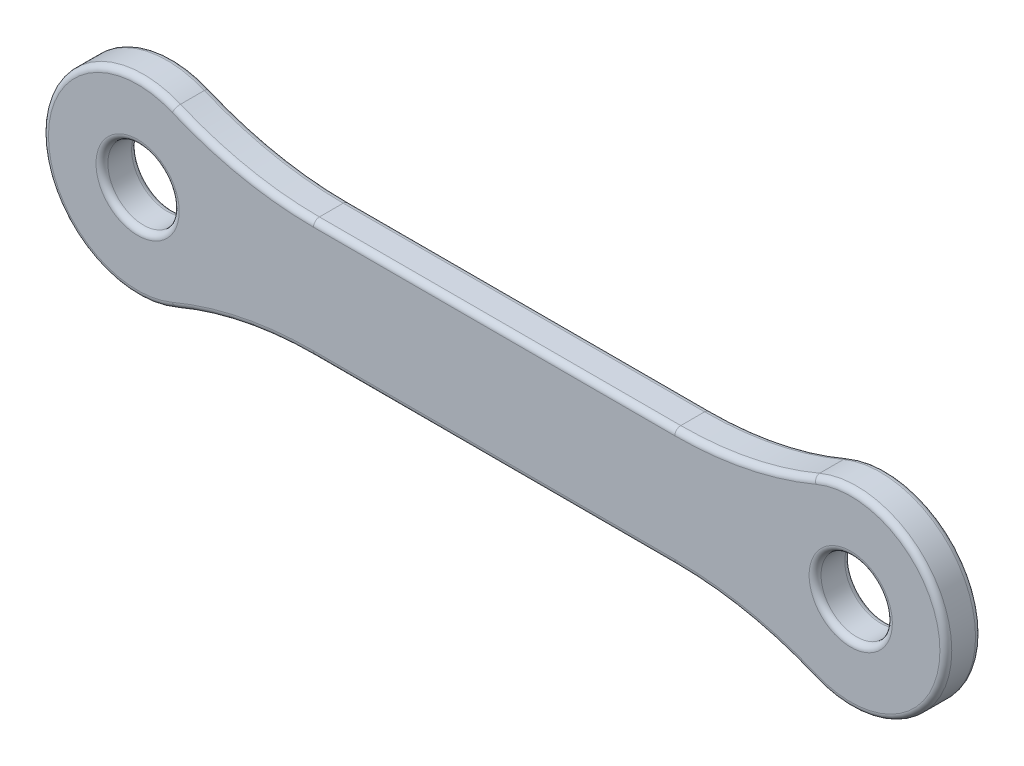
ISO-10303-21;
HEADER;
FILE_DESCRIPTION(('STEP AP214'),'2;1');
FILE_NAME('part.step','',(''),(''),'','','');
FILE_SCHEMA(('AUTOMOTIVE_DESIGN { 1 0 10303 214 1 1 1 1 }'));
ENDSEC;
DATA;
#1=APPLICATION_CONTEXT('core data for automotive mechanical design processes');
#2=APPLICATION_PROTOCOL_DEFINITION('international standard','automotive_design',2000,#1);
#3=PRODUCT_CONTEXT('',#1,'mechanical');
#4=PRODUCT('Part','Part','',(#3));
#5=PRODUCT_RELATED_PRODUCT_CATEGORY('part','',(#4));
#6=PRODUCT_DEFINITION_FORMATION('','',#4);
#7=PRODUCT_DEFINITION_CONTEXT('part definition',#1,'design');
#8=PRODUCT_DEFINITION('design','',#6,#7);
#9=PRODUCT_DEFINITION_SHAPE('','',#8);
#10=(LENGTH_UNIT() NAMED_UNIT(*) SI_UNIT(.MILLI.,.METRE.));
#11=(NAMED_UNIT(*) PLANE_ANGLE_UNIT() SI_UNIT($,.RADIAN.));
#12=(NAMED_UNIT(*) SI_UNIT($,.STERADIAN.) SOLID_ANGLE_UNIT());
#13=UNCERTAINTY_MEASURE_WITH_UNIT(LENGTH_MEASURE(1.E-05),#10,'distance_accuracy_value','');
#14=(GEOMETRIC_REPRESENTATION_CONTEXT(3) GLOBAL_UNCERTAINTY_ASSIGNED_CONTEXT((#13)) GLOBAL_UNIT_ASSIGNED_CONTEXT((#10,
#11,#12)) REPRESENTATION_CONTEXT('',''));
#15=CARTESIAN_POINT('',(0.,0.,0.));
#16=DIRECTION('',(0.,0.,1.));
#17=DIRECTION('',(1.,0.,0.));
#18=AXIS2_PLACEMENT_3D('',#15,#16,#17);
#19=CARTESIAN_POINT('',(0.,0.,3.));
#20=DIRECTION('',(0.,0.,1.));
#21=DIRECTION('',(1.,0.,0.));
#22=AXIS2_PLACEMENT_3D('',#19,#20,#21);
#23=PLANE('',#22);
#24=CARTESIAN_POINT('',(60.,0.,3.));
#25=DIRECTION('',(0.,0.,1.));
#26=DIRECTION('',(1.,0.,0.));
#27=AXIS2_PLACEMENT_3D('',#24,#25,#26);
#28=CIRCLE('',#27,3.50000000000001);
#29=CARTESIAN_POINT('',(63.5,0.,3.));
#30=VERTEX_POINT('',#29);
#31=EDGE_CURVE('E11',#30,#30,#28,.F.);
#32=ORIENTED_EDGE('',*,*,#31,.T.);
#33=EDGE_LOOP('',(#32));
#34=FACE_BOUND('',#33,.T.);
#35=CARTESIAN_POINT('',(0.,0.,3.));
#36=DIRECTION('',(0.,0.,1.));
#37=DIRECTION('',(1.,0.,0.));
#38=AXIS2_PLACEMENT_3D('',#35,#36,#37);
#39=CIRCLE('',#38,3.5);
#40=CARTESIAN_POINT('',(3.5,0.,3.));
#41=VERTEX_POINT('',#40);
#42=EDGE_CURVE('E49',#41,#41,#39,.F.);
#43=ORIENTED_EDGE('',*,*,#42,.T.);
#44=EDGE_LOOP('',(#43));
#45=FACE_BOUND('',#44,.T.);
#46=DIRECTION('',(-1.,0.,0.));
#47=VECTOR('',#46,1.);
#48=CARTESIAN_POINT('',(14.7986485869487,4.5,3.));
#49=LINE('',#48,#47);
#50=CARTESIAN_POINT('',(45.2013514130512,4.5,3.));
#51=VERTEX_POINT('',#50);
#52=CARTESIAN_POINT('',(14.7986485869487,4.5,3.));
#53=VERTEX_POINT('',#52);
#54=EDGE_CURVE('E57',#51,#53,#49,.T.);
#55=ORIENTED_EDGE('',*,*,#54,.T.);
#56=CARTESIAN_POINT('',(14.7986485869487,35.,3.));
#57=DIRECTION('',(0.,0.,1.));
#58=DIRECTION('',(1.,0.,0.));
#59=AXIS2_PLACEMENT_3D('',#56,#57,#58);
#60=CIRCLE('',#59,30.5);
#61=CARTESIAN_POINT('',(2.92078590531883,6.9078947368421,3.));
#62=VERTEX_POINT('',#61);
#63=EDGE_CURVE('E248',#53,#62,#60,.F.);
#64=ORIENTED_EDGE('',*,*,#63,.T.);
#65=CARTESIAN_POINT('',(0.,0.,3.));
#66=DIRECTION('',(0.,0.,1.));
#67=DIRECTION('',(1.,0.,0.));
#68=AXIS2_PLACEMENT_3D('',#65,#66,#67);
#69=CIRCLE('',#68,7.5);
#70=CARTESIAN_POINT('',(2.92078590531883,-6.9078947368421,3.));
#71=VERTEX_POINT('',#70);
#72=EDGE_CURVE('E236',#62,#71,#69,.T.);
#73=ORIENTED_EDGE('',*,*,#72,.T.);
#74=CARTESIAN_POINT('',(14.7986485869487,-35.,3.));
#75=DIRECTION('',(0.,0.,1.));
#76=DIRECTION('',(1.,0.,0.));
#77=AXIS2_PLACEMENT_3D('',#74,#75,#76);
#78=CIRCLE('',#77,30.5);
#79=CARTESIAN_POINT('',(14.7986485869488,-4.5,3.));
#80=VERTEX_POINT('',#79);
#81=EDGE_CURVE('E238',#71,#80,#78,.F.);
#82=ORIENTED_EDGE('',*,*,#81,.T.);
#83=DIRECTION('',(1.,0.,0.));
#84=VECTOR('',#83,1.);
#85=CARTESIAN_POINT('',(45.2013514130512,-4.5,3.));
#86=LINE('',#85,#84);
#87=CARTESIAN_POINT('',(45.2013514130512,-4.5,3.));
#88=VERTEX_POINT('',#87);
#89=EDGE_CURVE('E240',#80,#88,#86,.T.);
#90=ORIENTED_EDGE('',*,*,#89,.T.);
#91=CARTESIAN_POINT('',(45.2013514130512,-35.,3.));
#92=DIRECTION('',(0.,0.,1.));
#93=DIRECTION('',(1.,0.,0.));
#94=AXIS2_PLACEMENT_3D('',#91,#92,#93);
#95=CIRCLE('',#94,30.5);
#96=CARTESIAN_POINT('',(57.0792140946812,-6.90789473684211,3.));
#97=VERTEX_POINT('',#96);
#98=EDGE_CURVE('E242',#88,#97,#95,.F.);
#99=ORIENTED_EDGE('',*,*,#98,.T.);
#100=CARTESIAN_POINT('',(60.,0.,3.));
#101=DIRECTION('',(0.,0.,1.));
#102=DIRECTION('',(1.,0.,0.));
#103=AXIS2_PLACEMENT_3D('',#100,#101,#102);
#104=CIRCLE('',#103,7.50000000000001);
#105=CARTESIAN_POINT('',(57.0792140946812,6.90789473684211,3.));
#106=VERTEX_POINT('',#105);
#107=EDGE_CURVE('E244',#97,#106,#104,.T.);
#108=ORIENTED_EDGE('',*,*,#107,.T.);
#109=CARTESIAN_POINT('',(45.2013514130512,35.,3.));
#110=DIRECTION('',(0.,0.,1.));
#111=DIRECTION('',(1.,0.,0.));
#112=AXIS2_PLACEMENT_3D('',#109,#110,#111);
#113=CIRCLE('',#112,30.5);
#114=EDGE_CURVE('E62',#106,#51,#113,.F.);
#115=ORIENTED_EDGE('',*,*,#114,.T.);
#116=EDGE_LOOP('',(#55,#64,#73,#82,#90,#99,#108,#115));
#117=FACE_BOUND('',#116,.T.);
#118=ADVANCED_FACE('F40',(#34,#45,#117),#23,.T.);
#119=CARTESIAN_POINT('',(0.,0.,0.));
#120=DIRECTION('',(0.,0.,1.));
#121=DIRECTION('',(1.,0.,0.));
#122=AXIS2_PLACEMENT_3D('',#119,#120,#121);
#123=PLANE('',#122);
#124=CARTESIAN_POINT('',(60.,0.,0.));
#125=DIRECTION('',(0.,0.,1.));
#126=DIRECTION('',(1.,0.,0.));
#127=AXIS2_PLACEMENT_3D('',#124,#125,#126);
#128=CIRCLE('',#127,3.50000000000001);
#129=CARTESIAN_POINT('',(63.5,0.,0.));
#130=VERTEX_POINT('',#129);
#131=EDGE_CURVE('E184',#130,#130,#128,.T.);
#132=ORIENTED_EDGE('',*,*,#131,.T.);
#133=EDGE_LOOP('',(#132));
#134=FACE_BOUND('',#133,.T.);
#135=CARTESIAN_POINT('',(0.,0.,0.));
#136=DIRECTION('',(0.,0.,1.));
#137=DIRECTION('',(1.,0.,0.));
#138=AXIS2_PLACEMENT_3D('',#135,#136,#137);
#139=CIRCLE('',#138,3.5);
#140=CARTESIAN_POINT('',(3.5,0.,0.));
#141=VERTEX_POINT('',#140);
#142=EDGE_CURVE('E181',#141,#141,#139,.T.);
#143=ORIENTED_EDGE('',*,*,#142,.T.);
#144=EDGE_LOOP('',(#143));
#145=FACE_BOUND('',#144,.T.);
#146=CARTESIAN_POINT('',(0.,0.,0.));
#147=DIRECTION('',(0.,0.,1.));
#148=DIRECTION('',(1.,0.,0.));
#149=AXIS2_PLACEMENT_3D('',#146,#147,#148);
#150=CIRCLE('',#149,7.5);
#151=CARTESIAN_POINT('',(2.92078590531883,-6.9078947368421,0.));
#152=VERTEX_POINT('',#151);
#153=CARTESIAN_POINT('',(2.92078590531883,6.9078947368421,0.));
#154=VERTEX_POINT('',#153);
#155=EDGE_CURVE('E179',#152,#154,#150,.F.);
#156=ORIENTED_EDGE('',*,*,#155,.T.);
#157=CARTESIAN_POINT('',(14.7986485869487,35.,0.));
#158=DIRECTION('',(0.,0.,1.));
#159=DIRECTION('',(1.,0.,0.));
#160=AXIS2_PLACEMENT_3D('',#157,#158,#159);
#161=CIRCLE('',#160,30.5);
#162=CARTESIAN_POINT('',(14.7986485869487,4.5,0.));
#163=VERTEX_POINT('',#162);
#164=EDGE_CURVE('E160',#154,#163,#161,.T.);
#165=ORIENTED_EDGE('',*,*,#164,.T.);
#166=DIRECTION('',(-1.,0.,0.));
#167=VECTOR('',#166,1.);
#168=CARTESIAN_POINT('',(0.,4.5,0.));
#169=LINE('',#168,#167);
#170=CARTESIAN_POINT('',(45.2013514130512,4.5,0.));
#171=VERTEX_POINT('',#170);
#172=EDGE_CURVE('E168',#163,#171,#169,.F.);
#173=ORIENTED_EDGE('',*,*,#172,.T.);
#174=CARTESIAN_POINT('',(45.2013514130512,35.,0.));
#175=DIRECTION('',(0.,0.,1.));
#176=DIRECTION('',(1.,0.,0.));
#177=AXIS2_PLACEMENT_3D('',#174,#175,#176);
#178=CIRCLE('',#177,30.5);
#179=CARTESIAN_POINT('',(57.0792140946812,6.90789473684211,0.));
#180=VERTEX_POINT('',#179);
#181=EDGE_CURVE('E174',#171,#180,#178,.T.);
#182=ORIENTED_EDGE('',*,*,#181,.T.);
#183=CARTESIAN_POINT('',(60.,0.,0.));
#184=DIRECTION('',(0.,0.,1.));
#185=DIRECTION('',(1.,0.,0.));
#186=AXIS2_PLACEMENT_3D('',#183,#184,#185);
#187=CIRCLE('',#186,7.50000000000001);
#188=CARTESIAN_POINT('',(57.0792140946812,-6.90789473684211,0.));
#189=VERTEX_POINT('',#188);
#190=EDGE_CURVE('E334',#180,#189,#187,.F.);
#191=ORIENTED_EDGE('',*,*,#190,.T.);
#192=CARTESIAN_POINT('',(45.2013514130512,-35.,0.));
#193=DIRECTION('',(0.,0.,1.));
#194=DIRECTION('',(1.,0.,0.));
#195=AXIS2_PLACEMENT_3D('',#192,#193,#194);
#196=CIRCLE('',#195,30.5);
#197=CARTESIAN_POINT('',(45.2013514130512,-4.5,0.));
#198=VERTEX_POINT('',#197);
#199=EDGE_CURVE('E336',#189,#198,#196,.T.);
#200=ORIENTED_EDGE('',*,*,#199,.T.);
#201=DIRECTION('',(1.,0.,0.));
#202=VECTOR('',#201,1.);
#203=CARTESIAN_POINT('',(0.,-4.5,0.));
#204=LINE('',#203,#202);
#205=CARTESIAN_POINT('',(14.7986485869488,-4.5,0.));
#206=VERTEX_POINT('',#205);
#207=EDGE_CURVE('E338',#198,#206,#204,.F.);
#208=ORIENTED_EDGE('',*,*,#207,.T.);
#209=CARTESIAN_POINT('',(14.7986485869487,-35.,0.));
#210=DIRECTION('',(0.,0.,1.));
#211=DIRECTION('',(1.,0.,0.));
#212=AXIS2_PLACEMENT_3D('',#209,#210,#211);
#213=CIRCLE('',#212,30.5);
#214=EDGE_CURVE('E186',#206,#152,#213,.T.);
#215=ORIENTED_EDGE('',*,*,#214,.T.);
#216=EDGE_LOOP('',(#156,#165,#173,#182,#191,#200,#208,#215));
#217=FACE_BOUND('',#216,.T.);
#218=ADVANCED_FACE('F177',(#134,#145,#217),#123,.F.);
#219=CARTESIAN_POINT('',(60.,-5.,3.));
#220=DIRECTION('',(0.,1.,0.));
#221=DIRECTION('',(0.,0.,1.));
#222=AXIS2_PLACEMENT_3D('',#219,#220,#221);
#223=PLANE('',#222);
#224=DIRECTION('',(0.,0.,1.));
#225=VECTOR('',#224,1.);
#226=CARTESIAN_POINT('',(14.7986485869488,-5.,3.));
#227=LINE('',#226,#225);
#228=CARTESIAN_POINT('',(14.7986485869488,-5.,2.5));
#229=VERTEX_POINT('',#228);
#230=CARTESIAN_POINT('',(14.7986485869488,-5.,0.5));
#231=VERTEX_POINT('',#230);
#232=EDGE_CURVE('E314',#229,#231,#227,.F.);
#233=ORIENTED_EDGE('',*,*,#232,.T.);
#234=DIRECTION('',(1.,0.,0.));
#235=VECTOR('',#234,1.);
#236=CARTESIAN_POINT('',(60.,-5.,0.5));
#237=LINE('',#236,#235);
#238=CARTESIAN_POINT('',(45.2013514130512,-5.,0.5));
#239=VERTEX_POINT('',#238);
#240=EDGE_CURVE('E218',#231,#239,#237,.T.);
#241=ORIENTED_EDGE('',*,*,#240,.T.);
#242=DIRECTION('',(0.,0.,1.));
#243=VECTOR('',#242,1.);
#244=CARTESIAN_POINT('',(45.2013514130512,-5.,3.));
#245=LINE('',#244,#243);
#246=CARTESIAN_POINT('',(45.2013514130512,-5.,2.5));
#247=VERTEX_POINT('',#246);
#248=EDGE_CURVE('E269',#239,#247,#245,.T.);
#249=ORIENTED_EDGE('',*,*,#248,.T.);
#250=DIRECTION('',(1.,0.,0.));
#251=VECTOR('',#250,1.);
#252=CARTESIAN_POINT('',(14.7986485869488,-5.,2.5));
#253=LINE('',#252,#251);
#254=EDGE_CURVE('E216',#247,#229,#253,.F.);
#255=ORIENTED_EDGE('',*,*,#254,.T.);
#256=EDGE_LOOP('',(#233,#241,#249,#255));
#257=FACE_BOUND('',#256,.T.);
#258=ADVANCED_FACE('F311',(#257),#223,.F.);
#259=CARTESIAN_POINT('',(0.,5.,3.));
#260=DIRECTION('',(0.,-1.,0.));
#261=DIRECTION('',(1.,0.,0.));
#262=AXIS2_PLACEMENT_3D('',#259,#260,#261);
#263=PLANE('',#262);
#264=DIRECTION('',(0.,0.,1.));
#265=VECTOR('',#264,1.);
#266=CARTESIAN_POINT('',(45.2013514130512,5.,3.));
#267=LINE('',#266,#265);
#268=CARTESIAN_POINT('',(45.2013514130512,5.,2.5));
#269=VERTEX_POINT('',#268);
#270=CARTESIAN_POINT('',(45.2013514130512,5.,0.5));
#271=VERTEX_POINT('',#270);
#272=EDGE_CURVE('E175',#269,#271,#267,.F.);
#273=ORIENTED_EDGE('',*,*,#272,.T.);
#274=DIRECTION('',(-1.,0.,0.));
#275=VECTOR('',#274,1.);
#276=CARTESIAN_POINT('',(0.,5.,0.5));
#277=LINE('',#276,#275);
#278=CARTESIAN_POINT('',(14.7986485869487,5.,0.5));
#279=VERTEX_POINT('',#278);
#280=EDGE_CURVE('E234',#271,#279,#277,.T.);
#281=ORIENTED_EDGE('',*,*,#280,.T.);
#282=DIRECTION('',(0.,0.,1.));
#283=VECTOR('',#282,1.);
#284=CARTESIAN_POINT('',(14.7986485869487,5.,3.));
#285=LINE('',#284,#283);
#286=CARTESIAN_POINT('',(14.7986485869487,5.,2.5));
#287=VERTEX_POINT('',#286);
#288=EDGE_CURVE('E328',#279,#287,#285,.T.);
#289=ORIENTED_EDGE('',*,*,#288,.T.);
#290=DIRECTION('',(-1.,0.,0.));
#291=VECTOR('',#290,1.);
#292=CARTESIAN_POINT('',(45.2013514130512,5.,2.5));
#293=LINE('',#292,#291);
#294=EDGE_CURVE('E232',#287,#269,#293,.F.);
#295=ORIENTED_EDGE('',*,*,#294,.T.);
#296=EDGE_LOOP('',(#273,#281,#289,#295));
#297=FACE_BOUND('',#296,.T.);
#298=ADVANCED_FACE('F368',(#297),#263,.F.);
#299=CARTESIAN_POINT('',(0.,0.,3.));
#300=DIRECTION('',(0.,0.,-1.));
#301=DIRECTION('',(-1.,0.,0.));
#302=AXIS2_PLACEMENT_3D('',#299,#300,#301);
#303=CYLINDRICAL_SURFACE('',#302,3.);
#304=CARTESIAN_POINT('',(0.,0.,0.5));
#305=DIRECTION('',(0.,0.,1.));
#306=DIRECTION('',(1.,0.,0.));
#307=AXIS2_PLACEMENT_3D('',#304,#305,#306);
#308=CIRCLE('',#307,3.);
#309=CARTESIAN_POINT('',(3.,0.,0.5));
#310=VERTEX_POINT('',#309);
#311=EDGE_CURVE('E201',#310,#310,#308,.F.);
#312=ORIENTED_EDGE('',*,*,#311,.T.);
#313=EDGE_LOOP('',(#312));
#314=FACE_BOUND('',#313,.T.);
#315=CARTESIAN_POINT('',(0.,0.,2.5));
#316=DIRECTION('',(0.,0.,1.));
#317=DIRECTION('',(1.,0.,0.));
#318=AXIS2_PLACEMENT_3D('',#315,#316,#317);
#319=CIRCLE('',#318,3.);
#320=CARTESIAN_POINT('',(3.,0.,2.5));
#321=VERTEX_POINT('',#320);
#322=EDGE_CURVE('E198',#321,#321,#319,.T.);
#323=ORIENTED_EDGE('',*,*,#322,.T.);
#324=EDGE_LOOP('',(#323));
#325=FACE_BOUND('',#324,.T.);
#326=ADVANCED_FACE('F406',(#314,#325),#303,.F.);
#327=CARTESIAN_POINT('',(60.,0.,3.));
#328=DIRECTION('',(0.,0.,-1.));
#329=DIRECTION('',(-1.,0.,0.));
#330=AXIS2_PLACEMENT_3D('',#327,#328,#329);
#331=CYLINDRICAL_SURFACE('',#330,3.00000000000001);
#332=CARTESIAN_POINT('',(60.,0.,0.5));
#333=DIRECTION('',(0.,0.,1.));
#334=DIRECTION('',(1.,0.,0.));
#335=AXIS2_PLACEMENT_3D('',#332,#333,#334);
#336=CIRCLE('',#335,3.00000000000001);
#337=CARTESIAN_POINT('',(63.,0.,0.5));
#338=VERTEX_POINT('',#337);
#339=EDGE_CURVE('E195',#338,#338,#336,.F.);
#340=ORIENTED_EDGE('',*,*,#339,.T.);
#341=EDGE_LOOP('',(#340));
#342=FACE_BOUND('',#341,.T.);
#343=CARTESIAN_POINT('',(60.,0.,2.5));
#344=DIRECTION('',(0.,0.,1.));
#345=DIRECTION('',(1.,0.,0.));
#346=AXIS2_PLACEMENT_3D('',#343,#344,#345);
#347=CIRCLE('',#346,3.00000000000001);
#348=CARTESIAN_POINT('',(63.,0.,2.5));
#349=VERTEX_POINT('',#348);
#350=EDGE_CURVE('E192',#349,#349,#347,.T.);
#351=ORIENTED_EDGE('',*,*,#350,.T.);
#352=EDGE_LOOP('',(#351));
#353=FACE_BOUND('',#352,.T.);
#354=ADVANCED_FACE('F670',(#342,#353),#331,.F.);
#355=CARTESIAN_POINT('',(0.,0.,-22.6274169979695));
#356=DIRECTION('',(0.,0.,1.));
#357=DIRECTION('',(1.,0.,0.));
#358=AXIS2_PLACEMENT_3D('',#355,#356,#357);
#359=CYLINDRICAL_SURFACE('',#358,8.);
#360=DIRECTION('',(0.,0.,1.));
#361=VECTOR('',#360,1.);
#362=CARTESIAN_POINT('',(3.11550496567342,7.36842105263158,-22.6274169979695));
#363=LINE('',#362,#361);
#364=CARTESIAN_POINT('',(3.11550496567342,7.36842105263158,2.5));
#365=VERTEX_POINT('',#364);
#366=CARTESIAN_POINT('',(3.11550496567342,7.36842105263158,0.5));
#367=VERTEX_POINT('',#366);
#368=EDGE_CURVE('E316',#365,#367,#363,.F.);
#369=ORIENTED_EDGE('',*,*,#368,.T.);
#370=CARTESIAN_POINT('',(0.,0.,0.5));
#371=DIRECTION('',(0.,0.,1.));
#372=DIRECTION('',(1.,0.,0.));
#373=AXIS2_PLACEMENT_3D('',#370,#371,#372);
#374=CIRCLE('',#373,8.);
#375=CARTESIAN_POINT('',(3.11550496567342,-7.36842105263158,0.5));
#376=VERTEX_POINT('',#375);
#377=EDGE_CURVE('E210',#367,#376,#374,.T.);
#378=ORIENTED_EDGE('',*,*,#377,.T.);
#379=DIRECTION('',(0.,0.,1.));
#380=VECTOR('',#379,1.);
#381=CARTESIAN_POINT('',(3.11550496567342,-7.36842105263158,-22.6274169979695));
#382=LINE('',#381,#380);
#383=CARTESIAN_POINT('',(3.11550496567342,-7.36842105263158,2.5));
#384=VERTEX_POINT('',#383);
#385=EDGE_CURVE('E321',#376,#384,#382,.T.);
#386=ORIENTED_EDGE('',*,*,#385,.T.);
#387=CARTESIAN_POINT('',(0.,0.,2.5));
#388=DIRECTION('',(0.,0.,1.));
#389=DIRECTION('',(1.,0.,0.));
#390=AXIS2_PLACEMENT_3D('',#387,#388,#389);
#391=CIRCLE('',#390,8.);
#392=EDGE_CURVE('E208',#384,#365,#391,.F.);
#393=ORIENTED_EDGE('',*,*,#392,.T.);
#394=EDGE_LOOP('',(#369,#378,#386,#393));
#395=FACE_BOUND('',#394,.T.);
#396=ADVANCED_FACE('F356',(#395),#359,.T.);
#397=CARTESIAN_POINT('',(60.,0.,-22.6274169979695));
#398=DIRECTION('',(0.,0.,1.));
#399=DIRECTION('',(1.,0.,0.));
#400=AXIS2_PLACEMENT_3D('',#397,#398,#399);
#401=CYLINDRICAL_SURFACE('',#400,8.00000000000001);
#402=DIRECTION('',(0.,0.,1.));
#403=VECTOR('',#402,1.);
#404=CARTESIAN_POINT('',(56.8844950343266,-7.36842105263158,-22.6274169979695));
#405=LINE('',#404,#403);
#406=CARTESIAN_POINT('',(56.8844950343266,-7.36842105263158,2.5));
#407=VERTEX_POINT('',#406);
#408=CARTESIAN_POINT('',(56.8844950343266,-7.36842105263158,0.5));
#409=VERTEX_POINT('',#408);
#410=EDGE_CURVE('E308',#407,#409,#405,.F.);
#411=ORIENTED_EDGE('',*,*,#410,.T.);
#412=CARTESIAN_POINT('',(60.,0.,0.5));
#413=DIRECTION('',(0.,0.,1.));
#414=DIRECTION('',(1.,0.,0.));
#415=AXIS2_PLACEMENT_3D('',#412,#413,#414);
#416=CIRCLE('',#415,8.00000000000001);
#417=CARTESIAN_POINT('',(56.8844950343266,7.36842105263158,0.5));
#418=VERTEX_POINT('',#417);
#419=EDGE_CURVE('E226',#409,#418,#416,.T.);
#420=ORIENTED_EDGE('',*,*,#419,.T.);
#421=DIRECTION('',(0.,0.,1.));
#422=VECTOR('',#421,1.);
#423=CARTESIAN_POINT('',(56.8844950343266,7.36842105263158,-22.6274169979695));
#424=LINE('',#423,#422);
#425=CARTESIAN_POINT('',(56.8844950343266,7.36842105263158,2.5));
#426=VERTEX_POINT('',#425);
#427=EDGE_CURVE('E324',#418,#426,#424,.T.);
#428=ORIENTED_EDGE('',*,*,#427,.T.);
#429=CARTESIAN_POINT('',(60.,0.,2.5));
#430=DIRECTION('',(0.,0.,1.));
#431=DIRECTION('',(1.,0.,0.));
#432=AXIS2_PLACEMENT_3D('',#429,#430,#431);
#433=CIRCLE('',#432,8.00000000000001);
#434=EDGE_CURVE('E224',#426,#407,#433,.F.);
#435=ORIENTED_EDGE('',*,*,#434,.T.);
#436=EDGE_LOOP('',(#411,#420,#428,#435));
#437=FACE_BOUND('',#436,.T.);
#438=ADVANCED_FACE('F416',(#437),#401,.T.);
#439=CARTESIAN_POINT('',(14.7986485869487,-35.,-22.6274169979695));
#440=DIRECTION('',(0.,0.,1.));
#441=DIRECTION('',(1.,0.,0.));
#442=AXIS2_PLACEMENT_3D('',#439,#440,#441);
#443=CYLINDRICAL_SURFACE('',#442,30.);
#444=ORIENTED_EDGE('',*,*,#385,.F.);
#445=CARTESIAN_POINT('',(14.7986485869487,-35.,0.5));
#446=DIRECTION('',(0.,0.,1.));
#447=DIRECTION('',(1.,0.,0.));
#448=AXIS2_PLACEMENT_3D('',#445,#446,#447);
#449=CIRCLE('',#448,30.);
#450=EDGE_CURVE('E214',#376,#231,#449,.F.);
#451=ORIENTED_EDGE('',*,*,#450,.T.);
#452=ORIENTED_EDGE('',*,*,#232,.F.);
#453=CARTESIAN_POINT('',(14.7986485869487,-35.,2.5));
#454=DIRECTION('',(0.,0.,1.));
#455=DIRECTION('',(1.,0.,0.));
#456=AXIS2_PLACEMENT_3D('',#453,#454,#455);
#457=CIRCLE('',#456,30.);
#458=EDGE_CURVE('E212',#229,#384,#457,.T.);
#459=ORIENTED_EDGE('',*,*,#458,.T.);
#460=EDGE_LOOP('',(#444,#451,#452,#459));
#461=FACE_BOUND('',#460,.T.);
#462=ADVANCED_FACE('F413',(#461),#443,.F.);
#463=CARTESIAN_POINT('',(45.2013514130512,-35.,-22.6274169979695));
#464=DIRECTION('',(0.,0.,1.));
#465=DIRECTION('',(1.,0.,0.));
#466=AXIS2_PLACEMENT_3D('',#463,#464,#465);
#467=CYLINDRICAL_SURFACE('',#466,30.);
#468=ORIENTED_EDGE('',*,*,#248,.F.);
#469=CARTESIAN_POINT('',(45.2013514130512,-35.,0.5));
#470=DIRECTION('',(0.,0.,1.));
#471=DIRECTION('',(1.,0.,0.));
#472=AXIS2_PLACEMENT_3D('',#469,#470,#471);
#473=CIRCLE('',#472,30.);
#474=EDGE_CURVE('E222',#239,#409,#473,.F.);
#475=ORIENTED_EDGE('',*,*,#474,.T.);
#476=ORIENTED_EDGE('',*,*,#410,.F.);
#477=CARTESIAN_POINT('',(45.2013514130512,-35.,2.5));
#478=DIRECTION('',(0.,0.,1.));
#479=DIRECTION('',(1.,0.,0.));
#480=AXIS2_PLACEMENT_3D('',#477,#478,#479);
#481=CIRCLE('',#480,30.);
#482=EDGE_CURVE('E220',#407,#247,#481,.T.);
#483=ORIENTED_EDGE('',*,*,#482,.T.);
#484=EDGE_LOOP('',(#468,#475,#476,#483));
#485=FACE_BOUND('',#484,.T.);
#486=ADVANCED_FACE('F305',(#485),#467,.F.);
#487=CARTESIAN_POINT('',(45.2013514130512,35.,-22.6274169979695));
#488=DIRECTION('',(0.,0.,1.));
#489=DIRECTION('',(1.,0.,0.));
#490=AXIS2_PLACEMENT_3D('',#487,#488,#489);
#491=CYLINDRICAL_SURFACE('',#490,30.);
#492=ORIENTED_EDGE('',*,*,#427,.F.);
#493=CARTESIAN_POINT('',(45.2013514130512,35.,0.5));
#494=DIRECTION('',(0.,0.,1.));
#495=DIRECTION('',(1.,0.,0.));
#496=AXIS2_PLACEMENT_3D('',#493,#494,#495);
#497=CIRCLE('',#496,30.);
#498=EDGE_CURVE('E230',#418,#271,#497,.F.);
#499=ORIENTED_EDGE('',*,*,#498,.T.);
#500=ORIENTED_EDGE('',*,*,#272,.F.);
#501=CARTESIAN_POINT('',(45.2013514130512,35.,2.5));
#502=DIRECTION('',(0.,0.,1.));
#503=DIRECTION('',(1.,0.,0.));
#504=AXIS2_PLACEMENT_3D('',#501,#502,#503);
#505=CIRCLE('',#504,30.);
#506=EDGE_CURVE('E228',#269,#426,#505,.T.);
#507=ORIENTED_EDGE('',*,*,#506,.T.);
#508=EDGE_LOOP('',(#492,#499,#500,#507));
#509=FACE_BOUND('',#508,.T.);
#510=ADVANCED_FACE('F420',(#509),#491,.F.);
#511=CARTESIAN_POINT('',(14.7986485869487,35.,-22.6274169979695));
#512=DIRECTION('',(0.,0.,1.));
#513=DIRECTION('',(1.,0.,0.));
#514=AXIS2_PLACEMENT_3D('',#511,#512,#513);
#515=CYLINDRICAL_SURFACE('',#514,30.);
#516=ORIENTED_EDGE('',*,*,#288,.F.);
#517=CARTESIAN_POINT('',(14.7986485869487,35.,0.5));
#518=DIRECTION('',(0.,0.,1.));
#519=DIRECTION('',(1.,0.,0.));
#520=AXIS2_PLACEMENT_3D('',#517,#518,#519);
#521=CIRCLE('',#520,30.);
#522=EDGE_CURVE('E162',#279,#367,#521,.F.);
#523=ORIENTED_EDGE('',*,*,#522,.T.);
#524=ORIENTED_EDGE('',*,*,#368,.F.);
#525=CARTESIAN_POINT('',(14.7986485869487,35.,2.5));
#526=DIRECTION('',(0.,0.,1.));
#527=DIRECTION('',(1.,0.,0.));
#528=AXIS2_PLACEMENT_3D('',#525,#526,#527);
#529=CIRCLE('',#528,30.);
#530=EDGE_CURVE('E204',#365,#287,#529,.T.);
#531=ORIENTED_EDGE('',*,*,#530,.T.);
#532=EDGE_LOOP('',(#516,#523,#524,#531));
#533=FACE_BOUND('',#532,.T.);
#534=ADVANCED_FACE('F354',(#533),#515,.F.);
#535=CARTESIAN_POINT('',(60.,0.,0.5));
#536=DIRECTION('',(0.,0.,1.));
#537=DIRECTION('',(1.,0.,0.));
#538=AXIS2_PLACEMENT_3D('',#535,#536,#537);
#539=TOROIDAL_SURFACE('',#538,3.50000000000001,0.5);
#540=ORIENTED_EDGE('',*,*,#339,.F.);
#541=EDGE_LOOP('',(#540));
#542=FACE_BOUND('',#541,.T.);
#543=ORIENTED_EDGE('',*,*,#131,.F.);
#544=EDGE_LOOP('',(#543));
#545=FACE_BOUND('',#544,.T.);
#546=ADVANCED_FACE('F425',(#542,#545),#539,.T.);
#547=CARTESIAN_POINT('',(0.,0.,0.5));
#548=DIRECTION('',(0.,0.,1.));
#549=DIRECTION('',(1.,0.,0.));
#550=AXIS2_PLACEMENT_3D('',#547,#548,#549);
#551=TOROIDAL_SURFACE('',#550,3.5,0.5);
#552=ORIENTED_EDGE('',*,*,#311,.F.);
#553=EDGE_LOOP('',(#552));
#554=FACE_BOUND('',#553,.T.);
#555=ORIENTED_EDGE('',*,*,#142,.F.);
#556=EDGE_LOOP('',(#555));
#557=FACE_BOUND('',#556,.T.);
#558=ADVANCED_FACE('F394',(#554,#557),#551,.T.);
#559=CARTESIAN_POINT('',(45.2013514130512,-35.,0.5));
#560=DIRECTION('',(0.,0.,1.));
#561=DIRECTION('',(1.,0.,0.));
#562=AXIS2_PLACEMENT_3D('',#559,#560,#561);
#563=TOROIDAL_SURFACE('',#562,30.5,0.5);
#564=CARTESIAN_POINT('',(57.0792140946812,-6.90789473684211,0.5));
#565=DIRECTION('',(0.921052631578945,-0.389438120709183,0.));
#566=DIRECTION('',(0.389438120709183,0.921052631578945,0.));
#567=AXIS2_PLACEMENT_3D('',#564,#565,#566);
#568=CIRCLE('',#567,0.5);
#569=EDGE_CURVE('E263',#409,#189,#568,.T.);
#570=ORIENTED_EDGE('',*,*,#569,.F.);
#571=ORIENTED_EDGE('',*,*,#474,.F.);
#572=CARTESIAN_POINT('',(45.2013514130512,-4.5,0.5));
#573=DIRECTION('',(-1.,0.,0.));
#574=DIRECTION('',(0.,0.,1.));
#575=AXIS2_PLACEMENT_3D('',#572,#573,#574);
#576=CIRCLE('',#575,0.5);
#577=EDGE_CURVE('E266',#198,#239,#576,.T.);
#578=ORIENTED_EDGE('',*,*,#577,.F.);
#579=ORIENTED_EDGE('',*,*,#199,.F.);
#580=EDGE_LOOP('',(#570,#571,#578,#579));
#581=FACE_BOUND('',#580,.T.);
#582=ADVANCED_FACE('F383',(#581),#563,.T.);
#583=CARTESIAN_POINT('',(60.,-4.5,0.5));
#584=DIRECTION('',(1.,0.,0.));
#585=DIRECTION('',(0.,0.,-1.));
#586=AXIS2_PLACEMENT_3D('',#583,#584,#585);
#587=CYLINDRICAL_SURFACE('',#586,0.5);
#588=ORIENTED_EDGE('',*,*,#577,.T.);
#589=ORIENTED_EDGE('',*,*,#240,.F.);
#590=CARTESIAN_POINT('',(14.7986485869488,-4.5,0.5));
#591=DIRECTION('',(-1.,0.,0.));
#592=DIRECTION('',(0.,0.,1.));
#593=AXIS2_PLACEMENT_3D('',#590,#591,#592);
#594=CIRCLE('',#593,0.5);
#595=EDGE_CURVE('E260',#206,#231,#594,.T.);
#596=ORIENTED_EDGE('',*,*,#595,.F.);
#597=ORIENTED_EDGE('',*,*,#207,.F.);
#598=EDGE_LOOP('',(#588,#589,#596,#597));
#599=FACE_BOUND('',#598,.T.);
#600=ADVANCED_FACE('F386',(#599),#587,.T.);
#601=CARTESIAN_POINT('',(60.,0.,0.5));
#602=DIRECTION('',(0.,0.,1.));
#603=DIRECTION('',(1.,0.,0.));
#604=AXIS2_PLACEMENT_3D('',#601,#602,#603);
#605=TOROIDAL_SURFACE('',#604,7.50000000000001,0.5);
#606=ORIENTED_EDGE('',*,*,#569,.T.);
#607=ORIENTED_EDGE('',*,*,#190,.F.);
#608=CARTESIAN_POINT('',(57.0792140946812,6.90789473684211,0.5));
#609=DIRECTION('',(-0.921052631578945,-0.389438120709183,0.));
#610=DIRECTION('',(0.389438120709183,-0.921052631578945,0.));
#611=AXIS2_PLACEMENT_3D('',#608,#609,#610);
#612=CIRCLE('',#611,0.5);
#613=EDGE_CURVE('E257',#418,#180,#612,.T.);
#614=ORIENTED_EDGE('',*,*,#613,.F.);
#615=ORIENTED_EDGE('',*,*,#419,.F.);
#616=EDGE_LOOP('',(#606,#607,#614,#615));
#617=FACE_BOUND('',#616,.T.);
#618=ADVANCED_FACE('F379',(#617),#605,.T.);
#619=CARTESIAN_POINT('',(14.7986485869487,-35.,0.5));
#620=DIRECTION('',(0.,0.,1.));
#621=DIRECTION('',(1.,0.,0.));
#622=AXIS2_PLACEMENT_3D('',#619,#620,#621);
#623=TOROIDAL_SURFACE('',#622,30.5,0.5);
#624=ORIENTED_EDGE('',*,*,#595,.T.);
#625=ORIENTED_EDGE('',*,*,#450,.F.);
#626=CARTESIAN_POINT('',(2.92078590531883,-6.9078947368421,0.5));
#627=DIRECTION('',(-0.921052631578947,-0.389438120709178,0.));
#628=DIRECTION('',(0.389438120709178,-0.921052631578947,0.));
#629=AXIS2_PLACEMENT_3D('',#626,#627,#628);
#630=CIRCLE('',#629,0.5);
#631=EDGE_CURVE('E254',#152,#376,#630,.T.);
#632=ORIENTED_EDGE('',*,*,#631,.F.);
#633=ORIENTED_EDGE('',*,*,#214,.F.);
#634=EDGE_LOOP('',(#624,#625,#632,#633));
#635=FACE_BOUND('',#634,.T.);
#636=ADVANCED_FACE('F345',(#635),#623,.T.);
#637=CARTESIAN_POINT('',(45.2013514130512,35.,0.5));
#638=DIRECTION('',(0.,0.,1.));
#639=DIRECTION('',(1.,0.,0.));
#640=AXIS2_PLACEMENT_3D('',#637,#638,#639);
#641=TOROIDAL_SURFACE('',#640,30.5,0.5);
#642=ORIENTED_EDGE('',*,*,#613,.T.);
#643=ORIENTED_EDGE('',*,*,#181,.F.);
#644=CARTESIAN_POINT('',(45.2013514130512,4.5,0.5));
#645=DIRECTION('',(-1.,0.,0.));
#646=DIRECTION('',(0.,0.,1.));
#647=AXIS2_PLACEMENT_3D('',#644,#645,#646);
#648=CIRCLE('',#647,0.5);
#649=EDGE_CURVE('E171',#271,#171,#648,.T.);
#650=ORIENTED_EDGE('',*,*,#649,.F.);
#651=ORIENTED_EDGE('',*,*,#498,.F.);
#652=EDGE_LOOP('',(#642,#643,#650,#651));
#653=FACE_BOUND('',#652,.T.);
#654=ADVANCED_FACE('F374',(#653),#641,.T.);
#655=CARTESIAN_POINT('',(0.,0.,0.5));
#656=DIRECTION('',(0.,0.,1.));
#657=DIRECTION('',(1.,0.,0.));
#658=AXIS2_PLACEMENT_3D('',#655,#656,#657);
#659=TOROIDAL_SURFACE('',#658,7.5,0.5);
#660=ORIENTED_EDGE('',*,*,#631,.T.);
#661=ORIENTED_EDGE('',*,*,#377,.F.);
#662=CARTESIAN_POINT('',(2.92078590531883,6.9078947368421,0.5));
#663=DIRECTION('',(0.921052631578947,-0.389438120709178,0.));
#664=DIRECTION('',(0.389438120709178,0.921052631578947,0.));
#665=AXIS2_PLACEMENT_3D('',#662,#663,#664);
#666=CIRCLE('',#665,0.5);
#667=EDGE_CURVE('E165',#154,#367,#666,.T.);
#668=ORIENTED_EDGE('',*,*,#667,.F.);
#669=ORIENTED_EDGE('',*,*,#155,.F.);
#670=EDGE_LOOP('',(#660,#661,#668,#669));
#671=FACE_BOUND('',#670,.T.);
#672=ADVANCED_FACE('F348',(#671),#659,.T.);
#673=CARTESIAN_POINT('',(0.,4.5,0.5));
#674=DIRECTION('',(-1.,0.,0.));
#675=DIRECTION('',(0.,-1.,0.));
#676=AXIS2_PLACEMENT_3D('',#673,#674,#675);
#677=CYLINDRICAL_SURFACE('',#676,0.5);
#678=ORIENTED_EDGE('',*,*,#649,.T.);
#679=ORIENTED_EDGE('',*,*,#172,.F.);
#680=CARTESIAN_POINT('',(14.7986485869487,4.5,0.5));
#681=DIRECTION('',(-1.,0.,0.));
#682=DIRECTION('',(0.,0.,1.));
#683=AXIS2_PLACEMENT_3D('',#680,#681,#682);
#684=CIRCLE('',#683,0.5);
#685=EDGE_CURVE('E156',#279,#163,#684,.T.);
#686=ORIENTED_EDGE('',*,*,#685,.F.);
#687=ORIENTED_EDGE('',*,*,#280,.F.);
#688=EDGE_LOOP('',(#678,#679,#686,#687));
#689=FACE_BOUND('',#688,.T.);
#690=ADVANCED_FACE('F169',(#689),#677,.T.);
#691=CARTESIAN_POINT('',(14.7986485869487,35.,0.5));
#692=DIRECTION('',(0.,0.,1.));
#693=DIRECTION('',(1.,0.,0.));
#694=AXIS2_PLACEMENT_3D('',#691,#692,#693);
#695=TOROIDAL_SURFACE('',#694,30.5,0.5);
#696=ORIENTED_EDGE('',*,*,#667,.T.);
#697=ORIENTED_EDGE('',*,*,#522,.F.);
#698=ORIENTED_EDGE('',*,*,#685,.T.);
#699=ORIENTED_EDGE('',*,*,#164,.F.);
#700=EDGE_LOOP('',(#696,#697,#698,#699));
#701=FACE_BOUND('',#700,.T.);
#702=ADVANCED_FACE('F158',(#701),#695,.T.);
#703=CARTESIAN_POINT('',(60.,0.,2.5));
#704=DIRECTION('',(0.,0.,1.));
#705=DIRECTION('',(1.,0.,0.));
#706=AXIS2_PLACEMENT_3D('',#703,#704,#705);
#707=TOROIDAL_SURFACE('',#706,3.50000000000001,0.5);
#708=ORIENTED_EDGE('',*,*,#31,.F.);
#709=EDGE_LOOP('',(#708));
#710=FACE_BOUND('',#709,.T.);
#711=ORIENTED_EDGE('',*,*,#350,.F.);
#712=EDGE_LOOP('',(#711));
#713=FACE_BOUND('',#712,.T.);
#714=ADVANCED_FACE('F434',(#710,#713),#707,.T.);
#715=CARTESIAN_POINT('',(0.,0.,2.5));
#716=DIRECTION('',(0.,0.,1.));
#717=DIRECTION('',(1.,0.,0.));
#718=AXIS2_PLACEMENT_3D('',#715,#716,#717);
#719=TOROIDAL_SURFACE('',#718,3.5,0.5);
#720=ORIENTED_EDGE('',*,*,#42,.F.);
#721=EDGE_LOOP('',(#720));
#722=FACE_BOUND('',#721,.T.);
#723=ORIENTED_EDGE('',*,*,#322,.F.);
#724=EDGE_LOOP('',(#723));
#725=FACE_BOUND('',#724,.T.);
#726=ADVANCED_FACE('F468',(#722,#725),#719,.T.);
#727=CARTESIAN_POINT('',(45.2013514130512,-35.,2.5));
#728=DIRECTION('',(0.,0.,1.));
#729=DIRECTION('',(1.,0.,0.));
#730=AXIS2_PLACEMENT_3D('',#727,#728,#729);
#731=TOROIDAL_SURFACE('',#730,30.5,0.5);
#732=CARTESIAN_POINT('',(45.2013514130512,-4.5,2.5));
#733=DIRECTION('',(-1.,0.,0.));
#734=DIRECTION('',(0.,0.,1.));
#735=AXIS2_PLACEMENT_3D('',#732,#733,#734);
#736=CIRCLE('',#735,0.5);
#737=EDGE_CURVE('E285',#247,#88,#736,.T.);
#738=ORIENTED_EDGE('',*,*,#737,.F.);
#739=ORIENTED_EDGE('',*,*,#482,.F.);
#740=CARTESIAN_POINT('',(57.0792140946812,-6.90789473684211,2.5));
#741=DIRECTION('',(0.921052631578945,-0.389438120709184,0.));
#742=DIRECTION('',(0.389438120709184,0.921052631578945,0.));
#743=AXIS2_PLACEMENT_3D('',#740,#741,#742);
#744=CIRCLE('',#743,0.5);
#745=EDGE_CURVE('E44',#97,#407,#744,.T.);
#746=ORIENTED_EDGE('',*,*,#745,.F.);
#747=ORIENTED_EDGE('',*,*,#98,.F.);
#748=EDGE_LOOP('',(#738,#739,#746,#747));
#749=FACE_BOUND('',#748,.T.);
#750=ADVANCED_FACE('F42',(#749),#731,.T.);
#751=CARTESIAN_POINT('',(60.,0.,2.5));
#752=DIRECTION('',(0.,0.,1.));
#753=DIRECTION('',(1.,0.,0.));
#754=AXIS2_PLACEMENT_3D('',#751,#752,#753);
#755=TOROIDAL_SURFACE('',#754,7.50000000000001,0.5);
#756=ORIENTED_EDGE('',*,*,#745,.T.);
#757=ORIENTED_EDGE('',*,*,#434,.F.);
#758=CARTESIAN_POINT('',(57.0792140946812,6.90789473684211,2.5));
#759=DIRECTION('',(-0.921052631578945,-0.389438120709184,0.));
#760=DIRECTION('',(0.389438120709184,-0.921052631578945,0.));
#761=AXIS2_PLACEMENT_3D('',#758,#759,#760);
#762=CIRCLE('',#761,0.5);
#763=EDGE_CURVE('E283',#106,#426,#762,.T.);
#764=ORIENTED_EDGE('',*,*,#763,.F.);
#765=ORIENTED_EDGE('',*,*,#107,.F.);
#766=EDGE_LOOP('',(#756,#757,#764,#765));
#767=FACE_BOUND('',#766,.T.);
#768=ADVANCED_FACE('F296',(#767),#755,.T.);
#769=CARTESIAN_POINT('',(0.,-4.5,2.5));
#770=DIRECTION('',(-1.,0.,0.));
#771=DIRECTION('',(0.,0.,1.));
#772=AXIS2_PLACEMENT_3D('',#769,#770,#771);
#773=CYLINDRICAL_SURFACE('',#772,0.5);
#774=ORIENTED_EDGE('',*,*,#737,.T.);
#775=ORIENTED_EDGE('',*,*,#89,.F.);
#776=CARTESIAN_POINT('',(14.7986485869488,-4.5,2.5));
#777=DIRECTION('',(-1.,0.,0.));
#778=DIRECTION('',(0.,0.,1.));
#779=AXIS2_PLACEMENT_3D('',#776,#777,#778);
#780=CIRCLE('',#779,0.5);
#781=EDGE_CURVE('E280',#229,#80,#780,.T.);
#782=ORIENTED_EDGE('',*,*,#781,.F.);
#783=ORIENTED_EDGE('',*,*,#254,.F.);
#784=EDGE_LOOP('',(#774,#775,#782,#783));
#785=FACE_BOUND('',#784,.T.);
#786=ADVANCED_FACE('F488',(#785),#773,.T.);
#787=CARTESIAN_POINT('',(45.2013514130512,35.,2.5));
#788=DIRECTION('',(0.,0.,1.));
#789=DIRECTION('',(1.,0.,0.));
#790=AXIS2_PLACEMENT_3D('',#787,#788,#789);
#791=TOROIDAL_SURFACE('',#790,30.5,0.5);
#792=ORIENTED_EDGE('',*,*,#763,.T.);
#793=ORIENTED_EDGE('',*,*,#506,.F.);
#794=CARTESIAN_POINT('',(45.2013514130512,4.5,2.5));
#795=DIRECTION('',(-1.,0.,0.));
#796=DIRECTION('',(0.,0.,1.));
#797=AXIS2_PLACEMENT_3D('',#794,#795,#796);
#798=CIRCLE('',#797,0.5);
#799=EDGE_CURVE('E277',#51,#269,#798,.T.);
#800=ORIENTED_EDGE('',*,*,#799,.F.);
#801=ORIENTED_EDGE('',*,*,#114,.F.);
#802=EDGE_LOOP('',(#792,#793,#800,#801));
#803=FACE_BOUND('',#802,.T.);
#804=ADVANCED_FACE('F494',(#803),#791,.T.);
#805=CARTESIAN_POINT('',(14.7986485869487,-35.,2.5));
#806=DIRECTION('',(0.,0.,1.));
#807=DIRECTION('',(1.,0.,0.));
#808=AXIS2_PLACEMENT_3D('',#805,#806,#807);
#809=TOROIDAL_SURFACE('',#808,30.5,0.5);
#810=ORIENTED_EDGE('',*,*,#781,.T.);
#811=ORIENTED_EDGE('',*,*,#81,.F.);
#812=CARTESIAN_POINT('',(2.92078590531883,-6.90789473684211,2.5));
#813=DIRECTION('',(-0.921052631578947,-0.389438120709178,0.));
#814=DIRECTION('',(0.389438120709178,-0.921052631578947,0.));
#815=AXIS2_PLACEMENT_3D('',#812,#813,#814);
#816=CIRCLE('',#815,0.5);
#817=EDGE_CURVE('E274',#384,#71,#816,.T.);
#818=ORIENTED_EDGE('',*,*,#817,.F.);
#819=ORIENTED_EDGE('',*,*,#458,.F.);
#820=EDGE_LOOP('',(#810,#811,#818,#819));
#821=FACE_BOUND('',#820,.T.);
#822=ADVANCED_FACE('F501',(#821),#809,.T.);
#823=CARTESIAN_POINT('',(0.,4.5,2.5));
#824=DIRECTION('',(1.,0.,0.));
#825=DIRECTION('',(0.,1.,0.));
#826=AXIS2_PLACEMENT_3D('',#823,#824,#825);
#827=CYLINDRICAL_SURFACE('',#826,0.5);
#828=ORIENTED_EDGE('',*,*,#799,.T.);
#829=ORIENTED_EDGE('',*,*,#294,.F.);
#830=CARTESIAN_POINT('',(14.7986485869487,4.5,2.5));
#831=DIRECTION('',(-1.,0.,0.));
#832=DIRECTION('',(0.,0.,1.));
#833=AXIS2_PLACEMENT_3D('',#830,#831,#832);
#834=CIRCLE('',#833,0.5);
#835=EDGE_CURVE('E272',#53,#287,#834,.T.);
#836=ORIENTED_EDGE('',*,*,#835,.F.);
#837=ORIENTED_EDGE('',*,*,#54,.F.);
#838=EDGE_LOOP('',(#828,#829,#836,#837));
#839=FACE_BOUND('',#838,.T.);
#840=ADVANCED_FACE('F509',(#839),#827,.T.);
#841=CARTESIAN_POINT('',(0.,0.,2.5));
#842=DIRECTION('',(0.,0.,1.));
#843=DIRECTION('',(1.,0.,0.));
#844=AXIS2_PLACEMENT_3D('',#841,#842,#843);
#845=TOROIDAL_SURFACE('',#844,7.5,0.5);
#846=ORIENTED_EDGE('',*,*,#817,.T.);
#847=ORIENTED_EDGE('',*,*,#72,.F.);
#848=CARTESIAN_POINT('',(2.92078590531883,6.90789473684211,2.5));
#849=DIRECTION('',(0.921052631578947,-0.389438120709178,0.));
#850=DIRECTION('',(0.389438120709178,0.921052631578947,0.));
#851=AXIS2_PLACEMENT_3D('',#848,#849,#850);
#852=CIRCLE('',#851,0.5);
#853=EDGE_CURVE('E270',#365,#62,#852,.T.);
#854=ORIENTED_EDGE('',*,*,#853,.F.);
#855=ORIENTED_EDGE('',*,*,#392,.F.);
#856=EDGE_LOOP('',(#846,#847,#854,#855));
#857=FACE_BOUND('',#856,.T.);
#858=ADVANCED_FACE('F361',(#857),#845,.T.);
#859=CARTESIAN_POINT('',(14.7986485869487,35.,2.5));
#860=DIRECTION('',(0.,0.,1.));
#861=DIRECTION('',(1.,0.,0.));
#862=AXIS2_PLACEMENT_3D('',#859,#860,#861);
#863=TOROIDAL_SURFACE('',#862,30.5,0.5);
#864=ORIENTED_EDGE('',*,*,#835,.T.);
#865=ORIENTED_EDGE('',*,*,#530,.F.);
#866=ORIENTED_EDGE('',*,*,#853,.T.);
#867=ORIENTED_EDGE('',*,*,#63,.F.);
#868=EDGE_LOOP('',(#864,#865,#866,#867));
#869=FACE_BOUND('',#868,.T.);
#870=ADVANCED_FACE('F365',(#869),#863,.T.);
#871=CLOSED_SHELL('',(#118,#218,#258,#298,#326,#354,#396,#438,#462,#486,#510,#534,#546,#558,
#582,#600,#618,#636,#654,#672,#690,#702,#714,#726,#750,#768,#786,#804,#822,#840,#858,#870));
#872=MANIFOLD_SOLID_BREP('B2',#871);
#873=ADVANCED_BREP_SHAPE_REPRESENTATION('',(#18,#872),#14);
#874=SHAPE_DEFINITION_REPRESENTATION(#9,#873);
ENDSEC;
END-ISO-10303-21;
